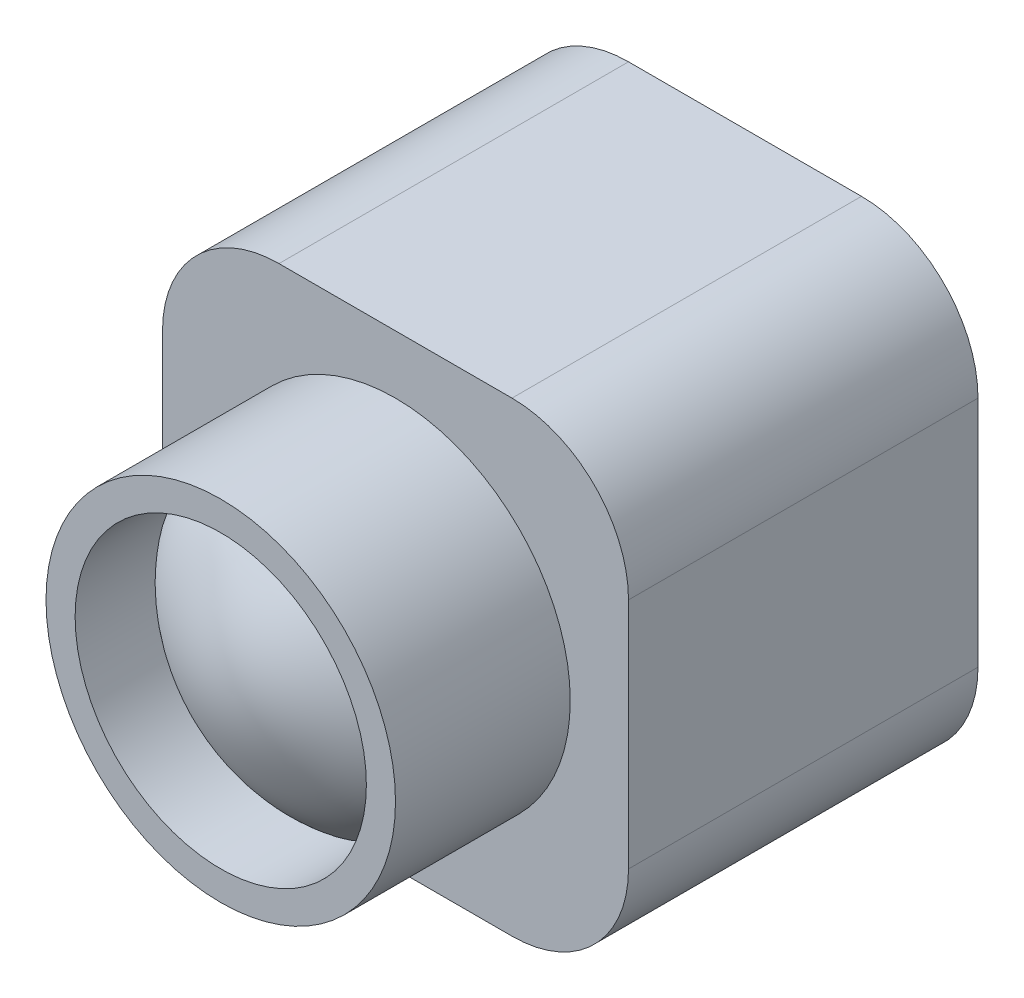
ISO-10303-21;
HEADER;
FILE_DESCRIPTION(('STEP AP214'),'2;1');
FILE_NAME('part.step','',(''),(''),'','','');
FILE_SCHEMA(('AUTOMOTIVE_DESIGN { 1 0 10303 214 1 1 1 1 }'));
ENDSEC;
DATA;
#1=APPLICATION_CONTEXT('core data for automotive mechanical design processes');
#2=APPLICATION_PROTOCOL_DEFINITION('international standard','automotive_design',2000,#1);
#3=PRODUCT_CONTEXT('',#1,'mechanical');
#4=PRODUCT('Part','Part','',(#3));
#5=PRODUCT_RELATED_PRODUCT_CATEGORY('part','',(#4));
#6=PRODUCT_DEFINITION_FORMATION('','',#4);
#7=PRODUCT_DEFINITION_CONTEXT('part definition',#1,'design');
#8=PRODUCT_DEFINITION('design','',#6,#7);
#9=PRODUCT_DEFINITION_SHAPE('','',#8);
#10=(LENGTH_UNIT() NAMED_UNIT(*) SI_UNIT(.MILLI.,.METRE.));
#11=(NAMED_UNIT(*) PLANE_ANGLE_UNIT() SI_UNIT($,.RADIAN.));
#12=(NAMED_UNIT(*) SI_UNIT($,.STERADIAN.) SOLID_ANGLE_UNIT());
#13=UNCERTAINTY_MEASURE_WITH_UNIT(LENGTH_MEASURE(1.E-05),#10,'distance_accuracy_value','');
#14=(GEOMETRIC_REPRESENTATION_CONTEXT(3) GLOBAL_UNCERTAINTY_ASSIGNED_CONTEXT((#13)) GLOBAL_UNIT_ASSIGNED_CONTEXT((#10,
#11,#12)) REPRESENTATION_CONTEXT('',''));
#15=CARTESIAN_POINT('',(0.,0.,0.));
#16=DIRECTION('',(0.,0.,1.));
#17=DIRECTION('',(1.,0.,0.));
#18=AXIS2_PLACEMENT_3D('',#15,#16,#17);
#19=CARTESIAN_POINT('',(-10.,10.,-30.));
#20=DIRECTION('',(0.,0.,1.));
#21=DIRECTION('',(1.,0.,0.));
#22=AXIS2_PLACEMENT_3D('',#19,#20,#21);
#23=CYLINDRICAL_SURFACE('',#22,10.);
#24=CARTESIAN_POINT('',(-10.,10.,0.));
#25=DIRECTION('',(0.,0.,1.));
#26=DIRECTION('',(-1.,0.,0.));
#27=AXIS2_PLACEMENT_3D('',#24,#25,#26);
#28=CIRCLE('',#27,10.);
#29=CARTESIAN_POINT('',(-9.99999999999993,20.,0.));
#30=VERTEX_POINT('',#29);
#31=CARTESIAN_POINT('',(-20.,9.99999999999993,0.));
#32=VERTEX_POINT('',#31);
#33=EDGE_CURVE('E136',#30,#32,#28,.T.);
#34=ORIENTED_EDGE('',*,*,#33,.F.);
#35=DIRECTION('',(0.,0.,1.));
#36=VECTOR('',#35,1.);
#37=CARTESIAN_POINT('',(-9.99999999999993,20.,-30.));
#38=LINE('',#37,#36);
#39=CARTESIAN_POINT('',(-9.99999999999993,20.,-30.));
#40=VERTEX_POINT('',#39);
#41=EDGE_CURVE('E44',#40,#30,#38,.T.);
#42=ORIENTED_EDGE('',*,*,#41,.F.);
#43=CARTESIAN_POINT('',(-10.,10.,-30.));
#44=DIRECTION('',(0.,0.,1.));
#45=DIRECTION('',(-1.,0.,0.));
#46=AXIS2_PLACEMENT_3D('',#43,#44,#45);
#47=CIRCLE('',#46,10.);
#48=CARTESIAN_POINT('',(-20.,9.99999999999993,-30.));
#49=VERTEX_POINT('',#48);
#50=EDGE_CURVE('E158',#40,#49,#47,.T.);
#51=ORIENTED_EDGE('',*,*,#50,.T.);
#52=DIRECTION('',(0.,0.,1.));
#53=VECTOR('',#52,1.);
#54=CARTESIAN_POINT('',(-20.,9.99999999999993,-30.));
#55=LINE('',#54,#53);
#56=EDGE_CURVE('E38',#49,#32,#55,.T.);
#57=ORIENTED_EDGE('',*,*,#56,.T.);
#58=EDGE_LOOP('',(#34,#42,#51,#57));
#59=FACE_BOUND('',#58,.T.);
#60=ADVANCED_FACE('F35',(#59),#23,.T.);
#61=CARTESIAN_POINT('',(-9.99999999999993,20.,-30.));
#62=DIRECTION('',(0.,1.,0.));
#63=DIRECTION('',(0.,0.,1.));
#64=AXIS2_PLACEMENT_3D('',#61,#62,#63);
#65=PLANE('',#64);
#66=DIRECTION('',(-1.,0.,0.));
#67=VECTOR('',#66,1.);
#68=CARTESIAN_POINT('',(-9.99999999999993,20.,0.));
#69=LINE('',#68,#67);
#70=CARTESIAN_POINT('',(9.99999999999992,20.,0.));
#71=VERTEX_POINT('',#70);
#72=EDGE_CURVE('E155',#71,#30,#69,.T.);
#73=ORIENTED_EDGE('',*,*,#72,.F.);
#74=DIRECTION('',(0.,0.,1.));
#75=VECTOR('',#74,1.);
#76=CARTESIAN_POINT('',(9.99999999999992,20.,-30.));
#77=LINE('',#76,#75);
#78=CARTESIAN_POINT('',(9.99999999999992,20.,-30.));
#79=VERTEX_POINT('',#78);
#80=EDGE_CURVE('E82',#79,#71,#77,.T.);
#81=ORIENTED_EDGE('',*,*,#80,.F.);
#82=DIRECTION('',(-1.,0.,0.));
#83=VECTOR('',#82,1.);
#84=CARTESIAN_POINT('',(-9.99999999999993,20.,-30.));
#85=LINE('',#84,#83);
#86=EDGE_CURVE('E126',#79,#40,#85,.T.);
#87=ORIENTED_EDGE('',*,*,#86,.T.);
#88=ORIENTED_EDGE('',*,*,#41,.T.);
#89=EDGE_LOOP('',(#73,#81,#87,#88));
#90=FACE_BOUND('',#89,.T.);
#91=ADVANCED_FACE('F170',(#90),#65,.T.);
#92=CARTESIAN_POINT('',(10.,10.,-30.));
#93=DIRECTION('',(0.,0.,1.));
#94=DIRECTION('',(1.,0.,0.));
#95=AXIS2_PLACEMENT_3D('',#92,#93,#94);
#96=CYLINDRICAL_SURFACE('',#95,10.);
#97=CARTESIAN_POINT('',(10.,10.,0.));
#98=DIRECTION('',(0.,0.,1.));
#99=DIRECTION('',(-1.,0.,0.));
#100=AXIS2_PLACEMENT_3D('',#97,#98,#99);
#101=CIRCLE('',#100,10.);
#102=CARTESIAN_POINT('',(20.,9.99999999999993,0.));
#103=VERTEX_POINT('',#102);
#104=EDGE_CURVE('E113',#103,#71,#101,.T.);
#105=ORIENTED_EDGE('',*,*,#104,.F.);
#106=DIRECTION('',(0.,0.,1.));
#107=VECTOR('',#106,1.);
#108=CARTESIAN_POINT('',(20.,9.99999999999993,-30.));
#109=LINE('',#108,#107);
#110=CARTESIAN_POINT('',(20.,9.99999999999993,-30.));
#111=VERTEX_POINT('',#110);
#112=EDGE_CURVE('E108',#111,#103,#109,.T.);
#113=ORIENTED_EDGE('',*,*,#112,.F.);
#114=CARTESIAN_POINT('',(10.,10.,-30.));
#115=DIRECTION('',(0.,0.,1.));
#116=DIRECTION('',(-1.,0.,0.));
#117=AXIS2_PLACEMENT_3D('',#114,#115,#116);
#118=CIRCLE('',#117,10.);
#119=EDGE_CURVE('E111',#111,#79,#118,.T.);
#120=ORIENTED_EDGE('',*,*,#119,.T.);
#121=ORIENTED_EDGE('',*,*,#80,.T.);
#122=EDGE_LOOP('',(#105,#113,#120,#121));
#123=FACE_BOUND('',#122,.T.);
#124=ADVANCED_FACE('F110',(#123),#96,.T.);
#125=CARTESIAN_POINT('',(20.,-9.99999999999993,-30.));
#126=DIRECTION('',(1.,0.,0.));
#127=DIRECTION('',(0.,0.,-1.));
#128=AXIS2_PLACEMENT_3D('',#125,#126,#127);
#129=PLANE('',#128);
#130=DIRECTION('',(0.,1.,0.));
#131=VECTOR('',#130,1.);
#132=CARTESIAN_POINT('',(20.,-9.99999999999993,0.));
#133=LINE('',#132,#131);
#134=CARTESIAN_POINT('',(20.,-10.,0.));
#135=VERTEX_POINT('',#134);
#136=EDGE_CURVE('E152',#135,#103,#133,.T.);
#137=ORIENTED_EDGE('',*,*,#136,.F.);
#138=DIRECTION('',(0.,0.,1.));
#139=VECTOR('',#138,1.);
#140=CARTESIAN_POINT('',(20.,-10.,-30.));
#141=LINE('',#140,#139);
#142=CARTESIAN_POINT('',(20.,-10.,-30.));
#143=VERTEX_POINT('',#142);
#144=EDGE_CURVE('E118',#143,#135,#141,.T.);
#145=ORIENTED_EDGE('',*,*,#144,.F.);
#146=DIRECTION('',(0.,1.,0.));
#147=VECTOR('',#146,1.);
#148=CARTESIAN_POINT('',(20.,-9.99999999999993,-30.));
#149=LINE('',#148,#147);
#150=EDGE_CURVE('E124',#143,#111,#149,.T.);
#151=ORIENTED_EDGE('',*,*,#150,.T.);
#152=ORIENTED_EDGE('',*,*,#112,.T.);
#153=EDGE_LOOP('',(#137,#145,#151,#152));
#154=FACE_BOUND('',#153,.T.);
#155=ADVANCED_FACE('F128',(#154),#129,.T.);
#156=CARTESIAN_POINT('',(10.,-10.,-30.));
#157=DIRECTION('',(0.,0.,1.));
#158=DIRECTION('',(1.,0.,0.));
#159=AXIS2_PLACEMENT_3D('',#156,#157,#158);
#160=CYLINDRICAL_SURFACE('',#159,10.);
#161=CARTESIAN_POINT('',(10.,-10.,0.));
#162=DIRECTION('',(0.,0.,1.));
#163=DIRECTION('',(1.,0.,0.));
#164=AXIS2_PLACEMENT_3D('',#161,#162,#163);
#165=CIRCLE('',#164,10.);
#166=CARTESIAN_POINT('',(9.99999999999993,-20.,0.));
#167=VERTEX_POINT('',#166);
#168=EDGE_CURVE('E149',#167,#135,#165,.T.);
#169=ORIENTED_EDGE('',*,*,#168,.F.);
#170=DIRECTION('',(0.,0.,1.));
#171=VECTOR('',#170,1.);
#172=CARTESIAN_POINT('',(9.99999999999993,-20.,-30.));
#173=LINE('',#172,#171);
#174=CARTESIAN_POINT('',(9.99999999999993,-20.,-30.));
#175=VERTEX_POINT('',#174);
#176=EDGE_CURVE('E162',#175,#167,#173,.T.);
#177=ORIENTED_EDGE('',*,*,#176,.F.);
#178=CARTESIAN_POINT('',(10.,-10.,-30.));
#179=DIRECTION('',(0.,0.,1.));
#180=DIRECTION('',(1.,0.,0.));
#181=AXIS2_PLACEMENT_3D('',#178,#179,#180);
#182=CIRCLE('',#181,10.);
#183=EDGE_CURVE('E129',#175,#143,#182,.T.);
#184=ORIENTED_EDGE('',*,*,#183,.T.);
#185=ORIENTED_EDGE('',*,*,#144,.T.);
#186=EDGE_LOOP('',(#169,#177,#184,#185));
#187=FACE_BOUND('',#186,.T.);
#188=ADVANCED_FACE('F183',(#187),#160,.T.);
#189=CARTESIAN_POINT('',(-9.99999999999993,-20.,-30.));
#190=DIRECTION('',(0.,-1.,0.));
#191=DIRECTION('',(0.,0.,-1.));
#192=AXIS2_PLACEMENT_3D('',#189,#190,#191);
#193=PLANE('',#192);
#194=DIRECTION('',(1.,0.,0.));
#195=VECTOR('',#194,1.);
#196=CARTESIAN_POINT('',(-9.99999999999993,-20.,0.));
#197=LINE('',#196,#195);
#198=CARTESIAN_POINT('',(-9.99999999999993,-20.,0.));
#199=VERTEX_POINT('',#198);
#200=EDGE_CURVE('E146',#199,#167,#197,.T.);
#201=ORIENTED_EDGE('',*,*,#200,.F.);
#202=DIRECTION('',(0.,0.,1.));
#203=VECTOR('',#202,1.);
#204=CARTESIAN_POINT('',(-9.99999999999993,-20.,-30.));
#205=LINE('',#204,#203);
#206=CARTESIAN_POINT('',(-9.99999999999993,-20.,-30.));
#207=VERTEX_POINT('',#206);
#208=EDGE_CURVE('E164',#207,#199,#205,.T.);
#209=ORIENTED_EDGE('',*,*,#208,.F.);
#210=DIRECTION('',(1.,0.,0.));
#211=VECTOR('',#210,1.);
#212=CARTESIAN_POINT('',(-9.99999999999993,-20.,-30.));
#213=LINE('',#212,#211);
#214=EDGE_CURVE('E131',#207,#175,#213,.T.);
#215=ORIENTED_EDGE('',*,*,#214,.T.);
#216=ORIENTED_EDGE('',*,*,#176,.T.);
#217=EDGE_LOOP('',(#201,#209,#215,#216));
#218=FACE_BOUND('',#217,.T.);
#219=ADVANCED_FACE('F186',(#218),#193,.T.);
#220=CARTESIAN_POINT('',(-10.,-10.,-30.));
#221=DIRECTION('',(0.,0.,1.));
#222=DIRECTION('',(1.,0.,0.));
#223=AXIS2_PLACEMENT_3D('',#220,#221,#222);
#224=CYLINDRICAL_SURFACE('',#223,10.);
#225=CARTESIAN_POINT('',(-10.,-10.,0.));
#226=DIRECTION('',(0.,0.,1.));
#227=DIRECTION('',(-1.,0.,0.));
#228=AXIS2_PLACEMENT_3D('',#225,#226,#227);
#229=CIRCLE('',#228,10.);
#230=CARTESIAN_POINT('',(-20.,-9.99999999999993,0.));
#231=VERTEX_POINT('',#230);
#232=EDGE_CURVE('E143',#231,#199,#229,.T.);
#233=ORIENTED_EDGE('',*,*,#232,.F.);
#234=DIRECTION('',(0.,0.,1.));
#235=VECTOR('',#234,1.);
#236=CARTESIAN_POINT('',(-20.,-9.99999999999993,-30.));
#237=LINE('',#236,#235);
#238=CARTESIAN_POINT('',(-20.,-9.99999999999993,-30.));
#239=VERTEX_POINT('',#238);
#240=EDGE_CURVE('E165',#239,#231,#237,.T.);
#241=ORIENTED_EDGE('',*,*,#240,.F.);
#242=CARTESIAN_POINT('',(-10.,-10.,-30.));
#243=DIRECTION('',(0.,0.,1.));
#244=DIRECTION('',(-1.,0.,0.));
#245=AXIS2_PLACEMENT_3D('',#242,#243,#244);
#246=CIRCLE('',#245,10.);
#247=EDGE_CURVE('E238',#239,#207,#246,.T.);
#248=ORIENTED_EDGE('',*,*,#247,.T.);
#249=ORIENTED_EDGE('',*,*,#208,.T.);
#250=EDGE_LOOP('',(#233,#241,#248,#249));
#251=FACE_BOUND('',#250,.T.);
#252=ADVANCED_FACE('F190',(#251),#224,.T.);
#253=CARTESIAN_POINT('',(-20.,-9.99999999999993,-30.));
#254=DIRECTION('',(-1.,0.,0.));
#255=DIRECTION('',(0.,0.,1.));
#256=AXIS2_PLACEMENT_3D('',#253,#254,#255);
#257=PLANE('',#256);
#258=DIRECTION('',(0.,-1.,0.));
#259=VECTOR('',#258,1.);
#260=CARTESIAN_POINT('',(-20.,-9.99999999999993,0.));
#261=LINE('',#260,#259);
#262=EDGE_CURVE('E139',#32,#231,#261,.T.);
#263=ORIENTED_EDGE('',*,*,#262,.F.);
#264=ORIENTED_EDGE('',*,*,#56,.F.);
#265=DIRECTION('',(0.,-1.,0.));
#266=VECTOR('',#265,1.);
#267=CARTESIAN_POINT('',(-20.,-9.99999999999993,-30.));
#268=LINE('',#267,#266);
#269=EDGE_CURVE('E236',#49,#239,#268,.T.);
#270=ORIENTED_EDGE('',*,*,#269,.T.);
#271=ORIENTED_EDGE('',*,*,#240,.T.);
#272=EDGE_LOOP('',(#263,#264,#270,#271));
#273=FACE_BOUND('',#272,.T.);
#274=ADVANCED_FACE('F167',(#273),#257,.T.);
#275=CARTESIAN_POINT('',(-10.,10.,-30.));
#276=DIRECTION('',(0.,0.,-1.));
#277=DIRECTION('',(-1.,0.,0.));
#278=AXIS2_PLACEMENT_3D('',#275,#276,#277);
#279=PLANE('',#278);
#280=ORIENTED_EDGE('',*,*,#50,.F.);
#281=ORIENTED_EDGE('',*,*,#86,.F.);
#282=ORIENTED_EDGE('',*,*,#119,.F.);
#283=ORIENTED_EDGE('',*,*,#150,.F.);
#284=ORIENTED_EDGE('',*,*,#183,.F.);
#285=ORIENTED_EDGE('',*,*,#214,.F.);
#286=ORIENTED_EDGE('',*,*,#247,.F.);
#287=ORIENTED_EDGE('',*,*,#269,.F.);
#288=EDGE_LOOP('',(#280,#281,#282,#283,#284,#285,#286,#287));
#289=FACE_BOUND('',#288,.T.);
#290=ADVANCED_FACE('F122',(#289),#279,.T.);
#291=CARTESIAN_POINT('',(-10.,10.,0.));
#292=DIRECTION('',(0.,0.,-1.));
#293=DIRECTION('',(-1.,0.,0.));
#294=AXIS2_PLACEMENT_3D('',#291,#292,#293);
#295=PLANE('',#294);
#296=CARTESIAN_POINT('',(0.,0.,0.));
#297=DIRECTION('',(0.,0.,1.));
#298=DIRECTION('',(1.,0.,0.));
#299=AXIS2_PLACEMENT_3D('',#296,#297,#298);
#300=CIRCLE('',#299,15.);
#301=CARTESIAN_POINT('',(15.,0.,0.));
#302=VERTEX_POINT('',#301);
#303=EDGE_CURVE('E11',#302,#302,#300,.T.);
#304=ORIENTED_EDGE('',*,*,#303,.F.);
#305=EDGE_LOOP('',(#304));
#306=FACE_BOUND('',#305,.T.);
#307=ORIENTED_EDGE('',*,*,#33,.T.);
#308=ORIENTED_EDGE('',*,*,#262,.T.);
#309=ORIENTED_EDGE('',*,*,#232,.T.);
#310=ORIENTED_EDGE('',*,*,#200,.T.);
#311=ORIENTED_EDGE('',*,*,#168,.T.);
#312=ORIENTED_EDGE('',*,*,#136,.T.);
#313=ORIENTED_EDGE('',*,*,#104,.T.);
#314=ORIENTED_EDGE('',*,*,#72,.T.);
#315=EDGE_LOOP('',(#307,#308,#309,#310,#311,#312,#313,#314));
#316=FACE_BOUND('',#315,.T.);
#317=ADVANCED_FACE('F169',(#306,#316),#295,.F.);
#318=CARTESIAN_POINT('',(0.,0.,15.));
#319=DIRECTION('',(0.,0.,-1.));
#320=DIRECTION('',(-1.,0.,0.));
#321=AXIS2_PLACEMENT_3D('',#318,#319,#320);
#322=CYLINDRICAL_SURFACE('',#321,15.);
#323=CARTESIAN_POINT('',(0.,0.,15.));
#324=DIRECTION('',(0.,0.,1.));
#325=DIRECTION('',(1.,0.,0.));
#326=AXIS2_PLACEMENT_3D('',#323,#324,#325);
#327=CIRCLE('',#326,15.);
#328=CARTESIAN_POINT('',(15.,0.,15.));
#329=VERTEX_POINT('',#328);
#330=EDGE_CURVE('E140',#329,#329,#327,.T.);
#331=ORIENTED_EDGE('',*,*,#330,.F.);
#332=EDGE_LOOP('',(#331));
#333=FACE_BOUND('',#332,.T.);
#334=ORIENTED_EDGE('',*,*,#303,.T.);
#335=EDGE_LOOP('',(#334));
#336=FACE_BOUND('',#335,.T.);
#337=ADVANCED_FACE('F202',(#333,#336),#322,.T.);
#338=CARTESIAN_POINT('',(0.,0.,15.));
#339=DIRECTION('',(0.,0.,1.));
#340=DIRECTION('',(1.,0.,0.));
#341=AXIS2_PLACEMENT_3D('',#338,#339,#340);
#342=PLANE('',#341);
#343=CARTESIAN_POINT('',(0.,0.,15.));
#344=DIRECTION('',(0.,0.,1.));
#345=DIRECTION('',(1.,0.,0.));
#346=AXIS2_PLACEMENT_3D('',#343,#344,#345);
#347=CIRCLE('',#346,12.5);
#348=CARTESIAN_POINT('',(12.5,0.,15.));
#349=VERTEX_POINT('',#348);
#350=EDGE_CURVE('E230',#349,#349,#347,.T.);
#351=ORIENTED_EDGE('',*,*,#350,.F.);
#352=EDGE_LOOP('',(#351));
#353=FACE_BOUND('',#352,.T.);
#354=ORIENTED_EDGE('',*,*,#330,.T.);
#355=EDGE_LOOP('',(#354));
#356=FACE_BOUND('',#355,.T.);
#357=ADVANCED_FACE('F207',(#353,#356),#342,.T.);
#358=CARTESIAN_POINT('',(0.,0.,8.));
#359=DIRECTION('',(0.,0.,1.));
#360=DIRECTION('',(1.,0.,0.));
#361=AXIS2_PLACEMENT_3D('',#358,#359,#360);
#362=CYLINDRICAL_SURFACE('',#361,12.5);
#363=CARTESIAN_POINT('',(0.,0.,8.));
#364=DIRECTION('',(0.,0.,1.));
#365=DIRECTION('',(1.,0.,0.));
#366=AXIS2_PLACEMENT_3D('',#363,#364,#365);
#367=CIRCLE('',#366,12.5);
#368=CARTESIAN_POINT('',(12.5,0.,8.));
#369=VERTEX_POINT('',#368);
#370=EDGE_CURVE('E224',#369,#369,#367,.T.);
#371=ORIENTED_EDGE('',*,*,#370,.F.);
#372=EDGE_LOOP('',(#371));
#373=FACE_BOUND('',#372,.T.);
#374=ORIENTED_EDGE('',*,*,#350,.T.);
#375=EDGE_LOOP('',(#374));
#376=FACE_BOUND('',#375,.T.);
#377=ADVANCED_FACE('F211',(#373,#376),#362,.F.);
#378=CARTESIAN_POINT('',(0.,0.,14.));
#379=CARTESIAN_POINT('',(2.43397177498002,0.,14.0176245225266));
#380=CARTESIAN_POINT('',(6.9260169556571,0.,12.4114359702703));
#381=CARTESIAN_POINT('',(11.0191027467392,0.,9.93680019922569));
#382=CARTESIAN_POINT('',(12.5,0.,8.));
#383=B_SPLINE_CURVE_WITH_KNOTS('',3,(#378,#379,#380,#381,#382),.UNSPECIFIED.,.F.,.F.,(4,1,4),
(0.,0.499949420612737,1.),.UNSPECIFIED.);
#384=CARTESIAN_POINT('',(0.,0.,20.621681051989));
#385=DIRECTION('',(0.,0.,1.));
#386=AXIS1_PLACEMENT('',#384,#385);
#387=SURFACE_OF_REVOLUTION('',#383,#386);
#388=ORIENTED_EDGE('',*,*,#370,.T.);
#389=EDGE_LOOP('',(#388));
#390=FACE_BOUND('',#389,.T.);
#391=CARTESIAN_POINT('',(0.,0.,14.));
#392=VERTEX_POINT('',#391);
#393=VERTEX_LOOP('',#392);
#394=FACE_BOUND('',#393,.T.);
#395=ADVANCED_FACE('F215',(#390,#394),#387,.F.);
#396=CLOSED_SHELL('',(#60,#91,#124,#155,#188,#219,#252,#274,#290,#317,#337,#357,#377,#395));
#397=MANIFOLD_SOLID_BREP('B2',#396);
#398=ADVANCED_BREP_SHAPE_REPRESENTATION('',(#18,#397),#14);
#399=SHAPE_DEFINITION_REPRESENTATION(#9,#398);
ENDSEC;
END-ISO-10303-21;
